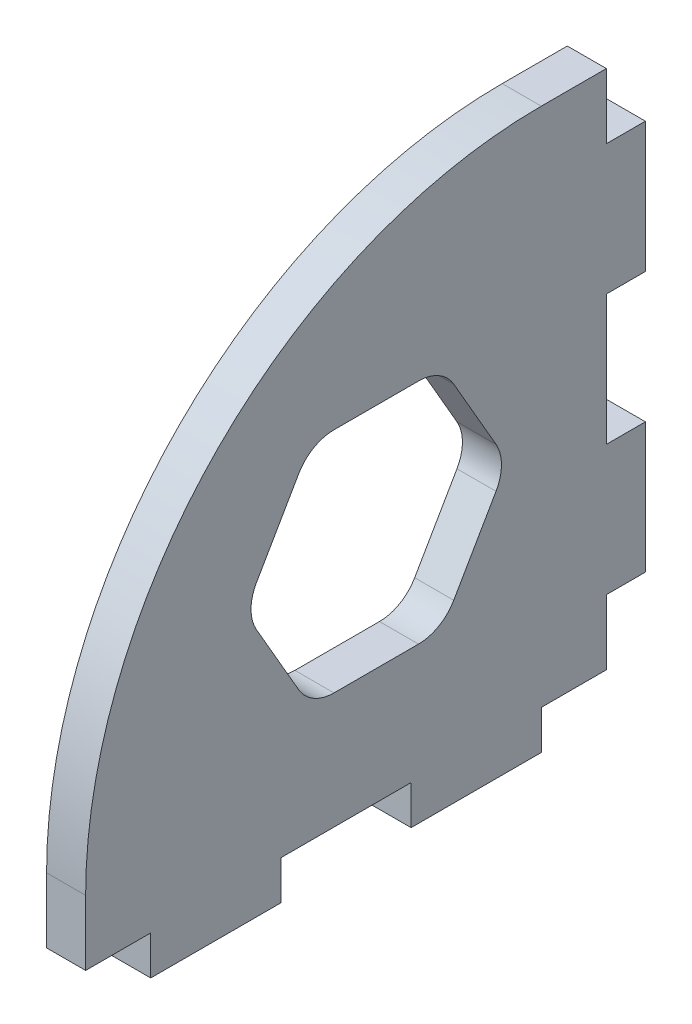
ISO-10303-21;
HEADER;
FILE_DESCRIPTION(('STEP AP214'),'2;1');
FILE_NAME('part.step','',(''),(''),'','','');
FILE_SCHEMA(('AUTOMOTIVE_DESIGN { 1 0 10303 214 1 1 1 1 }'));
ENDSEC;
DATA;
#1=APPLICATION_CONTEXT('core data for automotive mechanical design processes');
#2=APPLICATION_PROTOCOL_DEFINITION('international standard','automotive_design',2000,#1);
#3=PRODUCT_CONTEXT('',#1,'mechanical');
#4=PRODUCT('Part','Part','',(#3));
#5=PRODUCT_RELATED_PRODUCT_CATEGORY('part','',(#4));
#6=PRODUCT_DEFINITION_FORMATION('','',#4);
#7=PRODUCT_DEFINITION_CONTEXT('part definition',#1,'design');
#8=PRODUCT_DEFINITION('design','',#6,#7);
#9=PRODUCT_DEFINITION_SHAPE('','',#8);
#10=(LENGTH_UNIT() NAMED_UNIT(*) SI_UNIT(.MILLI.,.METRE.));
#11=(NAMED_UNIT(*) PLANE_ANGLE_UNIT() SI_UNIT($,.RADIAN.));
#12=(NAMED_UNIT(*) SI_UNIT($,.STERADIAN.) SOLID_ANGLE_UNIT());
#13=UNCERTAINTY_MEASURE_WITH_UNIT(LENGTH_MEASURE(1.E-05),#10,'distance_accuracy_value','');
#14=(GEOMETRIC_REPRESENTATION_CONTEXT(3) GLOBAL_UNCERTAINTY_ASSIGNED_CONTEXT((#13)) GLOBAL_UNIT_ASSIGNED_CONTEXT((#10,
#11,#12)) REPRESENTATION_CONTEXT('',''));
#15=CARTESIAN_POINT('',(0.,0.,0.));
#16=DIRECTION('',(0.,0.,1.));
#17=DIRECTION('',(1.,0.,0.));
#18=AXIS2_PLACEMENT_3D('',#15,#16,#17);
#19=CARTESIAN_POINT('',(1.5,4.99999999999995,5.));
#20=DIRECTION('',(-1.,0.,0.));
#21=DIRECTION('',(0.,0.,1.));
#22=AXIS2_PLACEMENT_3D('',#19,#20,#21);
#23=PLANE('',#22);
#24=DIRECTION('',(0.,1.,0.));
#25=VECTOR('',#24,1.);
#26=CARTESIAN_POINT('',(1.5,0.,0.));
#27=LINE('',#26,#25);
#28=CARTESIAN_POINT('',(1.5,0.,0.));
#29=VERTEX_POINT('',#28);
#30=CARTESIAN_POINT('',(1.5,5.,0.));
#31=VERTEX_POINT('',#30);
#32=EDGE_CURVE('E349',#29,#31,#27,.T.);
#33=ORIENTED_EDGE('',*,*,#32,.T.);
#34=DIRECTION('',(0.,0.,-1.));
#35=VECTOR('',#34,1.);
#36=CARTESIAN_POINT('',(1.5,5.,0.));
#37=LINE('',#36,#35);
#38=CARTESIAN_POINT('',(1.5,5.00000000000004,-2.99999999999994));
#39=VERTEX_POINT('',#38);
#40=EDGE_CURVE('E352',#31,#39,#37,.T.);
#41=ORIENTED_EDGE('',*,*,#40,.T.);
#42=DIRECTION('',(0.,1.,0.));
#43=VECTOR('',#42,1.);
#44=CARTESIAN_POINT('',(1.5,5.00000000000004,-2.99999999999994));
#45=LINE('',#44,#43);
#46=CARTESIAN_POINT('',(1.5,15.,-2.99999999999983));
#47=VERTEX_POINT('',#46);
#48=EDGE_CURVE('E355',#39,#47,#45,.T.);
#49=ORIENTED_EDGE('',*,*,#48,.T.);
#50=DIRECTION('',(0.,0.,1.));
#51=VECTOR('',#50,1.);
#52=CARTESIAN_POINT('',(1.5,15.,-2.99999999999983));
#53=LINE('',#52,#51);
#54=CARTESIAN_POINT('',(1.5,15.,1.73472347597681E-13));
#55=VERTEX_POINT('',#54);
#56=EDGE_CURVE('E357',#47,#55,#53,.T.);
#57=ORIENTED_EDGE('',*,*,#56,.T.);
#58=DIRECTION('',(0.,1.,0.));
#59=VECTOR('',#58,1.);
#60=CARTESIAN_POINT('',(1.5,15.,1.73472347597681E-13));
#61=LINE('',#60,#59);
#62=CARTESIAN_POINT('',(1.5,25.,2.91433543964104E-13));
#63=VERTEX_POINT('',#62);
#64=EDGE_CURVE('E359',#55,#63,#61,.T.);
#65=ORIENTED_EDGE('',*,*,#64,.T.);
#66=DIRECTION('',(0.,0.,-1.));
#67=VECTOR('',#66,1.);
#68=CARTESIAN_POINT('',(1.5,25.,2.91433543964104E-13));
#69=LINE('',#68,#67);
#70=CARTESIAN_POINT('',(1.5,25.,-2.99999999999971));
#71=VERTEX_POINT('',#70);
#72=EDGE_CURVE('E361',#63,#71,#69,.T.);
#73=ORIENTED_EDGE('',*,*,#72,.T.);
#74=DIRECTION('',(0.,1.,0.));
#75=VECTOR('',#74,1.);
#76=CARTESIAN_POINT('',(1.5,25.,-2.99999999999971));
#77=LINE('',#76,#75);
#78=CARTESIAN_POINT('',(1.5,35.,-2.99999999999959));
#79=VERTEX_POINT('',#78);
#80=EDGE_CURVE('E363',#71,#79,#77,.T.);
#81=ORIENTED_EDGE('',*,*,#80,.T.);
#82=DIRECTION('',(0.,0.,1.));
#83=VECTOR('',#82,1.);
#84=CARTESIAN_POINT('',(1.5,35.,-2.99999999999959));
#85=LINE('',#84,#83);
#86=CARTESIAN_POINT('',(1.5,35.,4.09394740330526E-13));
#87=VERTEX_POINT('',#86);
#88=EDGE_CURVE('E365',#79,#87,#85,.T.);
#89=ORIENTED_EDGE('',*,*,#88,.T.);
#90=DIRECTION('',(0.,1.,0.));
#91=VECTOR('',#90,1.);
#92=CARTESIAN_POINT('',(1.5,35.,4.09394740330526E-13));
#93=LINE('',#92,#91);
#94=CARTESIAN_POINT('',(1.5,40.,4.64905891561784E-13));
#95=VERTEX_POINT('',#94);
#96=EDGE_CURVE('E367',#87,#95,#93,.T.);
#97=ORIENTED_EDGE('',*,*,#96,.T.);
#98=DIRECTION('',(0.,0.,1.));
#99=VECTOR('',#98,1.);
#100=CARTESIAN_POINT('',(1.5,40.,4.64905891561784E-13));
#101=LINE('',#100,#99);
#102=CARTESIAN_POINT('',(1.5,40.,5.0000000000004));
#103=VERTEX_POINT('',#102);
#104=EDGE_CURVE('E369',#95,#103,#101,.T.);
#105=ORIENTED_EDGE('',*,*,#104,.T.);
#106=CARTESIAN_POINT('',(1.5,4.99999999999995,5.));
#107=DIRECTION('',(1.,0.,0.));
#108=DIRECTION('',(0.,0.,1.));
#109=AXIS2_PLACEMENT_3D('',#106,#107,#108);
#110=CIRCLE('',#109,35.);
#111=CARTESIAN_POINT('',(1.5,4.99999999999996,40.));
#112=VERTEX_POINT('',#111);
#113=EDGE_CURVE('E371',#103,#112,#110,.T.);
#114=ORIENTED_EDGE('',*,*,#113,.T.);
#115=DIRECTION('',(0.,-1.,0.));
#116=VECTOR('',#115,1.);
#117=CARTESIAN_POINT('',(1.5,0.,40.));
#118=LINE('',#117,#116);
#119=CARTESIAN_POINT('',(1.5,0.,40.));
#120=VERTEX_POINT('',#119);
#121=EDGE_CURVE('E373',#112,#120,#118,.T.);
#122=ORIENTED_EDGE('',*,*,#121,.T.);
#123=DIRECTION('',(0.,0.,-1.));
#124=VECTOR('',#123,1.);
#125=CARTESIAN_POINT('',(1.5,0.,35.));
#126=LINE('',#125,#124);
#127=CARTESIAN_POINT('',(1.5,0.,35.));
#128=VERTEX_POINT('',#127);
#129=EDGE_CURVE('E375',#120,#128,#126,.T.);
#130=ORIENTED_EDGE('',*,*,#129,.T.);
#131=DIRECTION('',(0.,-1.,0.));
#132=VECTOR('',#131,1.);
#133=CARTESIAN_POINT('',(1.5,-3.00000000000001,35.));
#134=LINE('',#133,#132);
#135=CARTESIAN_POINT('',(1.5,-3.00000000000001,35.));
#136=VERTEX_POINT('',#135);
#137=EDGE_CURVE('E377',#128,#136,#134,.T.);
#138=ORIENTED_EDGE('',*,*,#137,.T.);
#139=DIRECTION('',(0.,0.,-1.));
#140=VECTOR('',#139,1.);
#141=CARTESIAN_POINT('',(1.5,-3.,25.));
#142=LINE('',#141,#140);
#143=CARTESIAN_POINT('',(1.5,-3.,25.));
#144=VERTEX_POINT('',#143);
#145=EDGE_CURVE('E379',#136,#144,#142,.T.);
#146=ORIENTED_EDGE('',*,*,#145,.T.);
#147=DIRECTION('',(0.,1.,0.));
#148=VECTOR('',#147,1.);
#149=CARTESIAN_POINT('',(1.5,0.,25.));
#150=LINE('',#149,#148);
#151=CARTESIAN_POINT('',(1.5,0.,25.));
#152=VERTEX_POINT('',#151);
#153=EDGE_CURVE('E381',#144,#152,#150,.T.);
#154=ORIENTED_EDGE('',*,*,#153,.T.);
#155=DIRECTION('',(0.,0.,-1.));
#156=VECTOR('',#155,1.);
#157=CARTESIAN_POINT('',(1.5,0.,15.));
#158=LINE('',#157,#156);
#159=CARTESIAN_POINT('',(1.5,0.,15.));
#160=VERTEX_POINT('',#159);
#161=EDGE_CURVE('E383',#152,#160,#158,.T.);
#162=ORIENTED_EDGE('',*,*,#161,.T.);
#163=DIRECTION('',(0.,-1.,0.));
#164=VECTOR('',#163,1.);
#165=CARTESIAN_POINT('',(1.5,-3.,15.));
#166=LINE('',#165,#164);
#167=CARTESIAN_POINT('',(1.5,-3.,15.));
#168=VERTEX_POINT('',#167);
#169=EDGE_CURVE('E385',#160,#168,#166,.T.);
#170=ORIENTED_EDGE('',*,*,#169,.T.);
#171=DIRECTION('',(0.,0.,-1.));
#172=VECTOR('',#171,1.);
#173=CARTESIAN_POINT('',(1.5,-3.,5.));
#174=LINE('',#173,#172);
#175=CARTESIAN_POINT('',(1.5,-3.,5.));
#176=VERTEX_POINT('',#175);
#177=EDGE_CURVE('E387',#168,#176,#174,.T.);
#178=ORIENTED_EDGE('',*,*,#177,.T.);
#179=DIRECTION('',(0.,1.,0.));
#180=VECTOR('',#179,1.);
#181=CARTESIAN_POINT('',(1.5,0.,5.));
#182=LINE('',#181,#180);
#183=CARTESIAN_POINT('',(1.5,0.,5.));
#184=VERTEX_POINT('',#183);
#185=EDGE_CURVE('E389',#176,#184,#182,.T.);
#186=ORIENTED_EDGE('',*,*,#185,.T.);
#187=DIRECTION('',(0.,0.,-1.));
#188=VECTOR('',#187,1.);
#189=CARTESIAN_POINT('',(1.5,0.,0.));
#190=LINE('',#189,#188);
#191=EDGE_CURVE('E391',#184,#29,#190,.T.);
#192=ORIENTED_EDGE('',*,*,#191,.T.);
#193=EDGE_LOOP('',(#33,#41,#49,#57,#65,#73,#81,#89,#97,#105,#114,#122,#130,#138,#146,#154,#162,
#170,#178,#186,#192));
#194=FACE_BOUND('',#193,.T.);
#195=CARTESIAN_POINT('',(1.5,12.0526695296636,14.4300742654721));
#196=DIRECTION('',(1.,0.,0.));
#197=DIRECTION('',(0.,0.,-1.));
#198=AXIS2_PLACEMENT_3D('',#195,#196,#197);
#199=CIRCLE('',#198,3.125);
#200=CARTESIAN_POINT('',(1.5,8.92766952966359,14.4300742654721));
#201=VERTEX_POINT('',#200);
#202=CARTESIAN_POINT('',(1.5,10.4901695296636,11.7237448786458));
#203=VERTEX_POINT('',#202);
#204=EDGE_CURVE('E256',#201,#203,#199,.T.);
#205=ORIENTED_EDGE('',*,*,#204,.F.);
#206=DIRECTION('',(0.,0.,-1.));
#207=VECTOR('',#206,1.);
#208=CARTESIAN_POINT('',(1.5,8.92766952966359,20.9252647938554));
#209=LINE('',#208,#207);
#210=CARTESIAN_POINT('',(1.5,8.92766952966359,20.9252647938554));
#211=VERTEX_POINT('',#210);
#212=EDGE_CURVE('E297',#211,#201,#209,.T.);
#213=ORIENTED_EDGE('',*,*,#212,.F.);
#214=CARTESIAN_POINT('',(1.5,12.0526695296636,20.9252647938554));
#215=DIRECTION('',(1.,0.,0.));
#216=DIRECTION('',(0.,0.,-1.));
#217=AXIS2_PLACEMENT_3D('',#214,#215,#216);
#218=CIRCLE('',#217,3.125);
#219=CARTESIAN_POINT('',(1.5,10.4901695296636,23.6315941806818));
#220=VERTEX_POINT('',#219);
#221=EDGE_CURVE('E295',#220,#211,#218,.T.);
#222=ORIENTED_EDGE('',*,*,#221,.F.);
#223=DIRECTION('',(0.,-0.866025403784438,-0.5));
#224=VECTOR('',#223,1.);
#225=CARTESIAN_POINT('',(1.5,16.1151695296636,26.8791894448734));
#226=LINE('',#225,#224);
#227=CARTESIAN_POINT('',(1.5,16.1151695296636,26.8791894448734));
#228=VERTEX_POINT('',#227);
#229=EDGE_CURVE('E293',#228,#220,#226,.T.);
#230=ORIENTED_EDGE('',*,*,#229,.F.);
#231=CARTESIAN_POINT('',(1.5,17.6776695296636,24.1728600580471));
#232=DIRECTION('',(1.,0.,0.));
#233=DIRECTION('',(0.,0.,-1.));
#234=AXIS2_PLACEMENT_3D('',#231,#232,#233);
#235=CIRCLE('',#234,3.125);
#236=CARTESIAN_POINT('',(1.5,19.2401695296636,26.8791894448734));
#237=VERTEX_POINT('',#236);
#238=EDGE_CURVE('E291',#237,#228,#235,.T.);
#239=ORIENTED_EDGE('',*,*,#238,.F.);
#240=DIRECTION('',(0.,-0.866025403784438,0.500000000000001));
#241=VECTOR('',#240,1.);
#242=CARTESIAN_POINT('',(1.5,24.8651695296636,23.6315941806818));
#243=LINE('',#242,#241);
#244=CARTESIAN_POINT('',(1.5,24.8651695296636,23.6315941806818));
#245=VERTEX_POINT('',#244);
#246=EDGE_CURVE('E289',#245,#237,#243,.T.);
#247=ORIENTED_EDGE('',*,*,#246,.F.);
#248=CARTESIAN_POINT('',(1.5,23.3026695296636,20.9252647938554));
#249=DIRECTION('',(1.,0.,0.));
#250=DIRECTION('',(0.,0.,-1.));
#251=AXIS2_PLACEMENT_3D('',#248,#249,#250);
#252=CIRCLE('',#251,3.125);
#253=CARTESIAN_POINT('',(1.5,26.4276695296636,20.9252647938554));
#254=VERTEX_POINT('',#253);
#255=EDGE_CURVE('E287',#254,#245,#252,.T.);
#256=ORIENTED_EDGE('',*,*,#255,.F.);
#257=DIRECTION('',(0.,0.,1.));
#258=VECTOR('',#257,1.);
#259=CARTESIAN_POINT('',(1.5,26.4276695296636,14.4300742654721));
#260=LINE('',#259,#258);
#261=CARTESIAN_POINT('',(1.5,26.4276695296636,14.4300742654721));
#262=VERTEX_POINT('',#261);
#263=EDGE_CURVE('E285',#262,#254,#260,.T.);
#264=ORIENTED_EDGE('',*,*,#263,.F.);
#265=CARTESIAN_POINT('',(1.5,23.3026695296636,14.4300742654721));
#266=DIRECTION('',(1.,0.,0.));
#267=DIRECTION('',(0.,0.,-1.));
#268=AXIS2_PLACEMENT_3D('',#265,#266,#267);
#269=CIRCLE('',#268,3.125);
#270=CARTESIAN_POINT('',(1.5,24.8651695296636,11.7237448786458));
#271=VERTEX_POINT('',#270);
#272=EDGE_CURVE('E283',#271,#262,#269,.T.);
#273=ORIENTED_EDGE('',*,*,#272,.F.);
#274=DIRECTION('',(0.,0.866025403784439,0.5));
#275=VECTOR('',#274,1.);
#276=CARTESIAN_POINT('',(1.5,19.2401695296636,8.47614961445412));
#277=LINE('',#276,#275);
#278=CARTESIAN_POINT('',(1.5,19.2401695296636,8.47614961445412));
#279=VERTEX_POINT('',#278);
#280=EDGE_CURVE('E279',#279,#271,#277,.T.);
#281=ORIENTED_EDGE('',*,*,#280,.F.);
#282=CARTESIAN_POINT('',(1.5,17.6776695296636,11.1824790012805));
#283=DIRECTION('',(1.,0.,0.));
#284=DIRECTION('',(0.,0.,1.));
#285=AXIS2_PLACEMENT_3D('',#282,#283,#284);
#286=CIRCLE('',#285,3.125);
#287=CARTESIAN_POINT('',(1.5,16.1151695296636,8.47614961445412));
#288=VERTEX_POINT('',#287);
#289=EDGE_CURVE('E277',#288,#279,#286,.T.);
#290=ORIENTED_EDGE('',*,*,#289,.F.);
#291=DIRECTION('',(0.,0.866025403784438,-0.500000000000001));
#292=VECTOR('',#291,1.);
#293=CARTESIAN_POINT('',(1.5,10.4901695296636,11.7237448786458));
#294=LINE('',#293,#292);
#295=EDGE_CURVE('E264',#203,#288,#294,.T.);
#296=ORIENTED_EDGE('',*,*,#295,.F.);
#297=EDGE_LOOP('',(#205,#213,#222,#230,#239,#247,#256,#264,#273,#281,#290,#296));
#298=FACE_BOUND('',#297,.T.);
#299=ADVANCED_FACE('F41',(#194,#298),#23,.F.);
#300=CARTESIAN_POINT('',(-1.5,4.99999999999995,5.));
#301=DIRECTION('',(-1.,0.,0.));
#302=DIRECTION('',(0.,0.,1.));
#303=AXIS2_PLACEMENT_3D('',#300,#301,#302);
#304=PLANE('',#303);
#305=DIRECTION('',(0.,1.,0.));
#306=VECTOR('',#305,1.);
#307=CARTESIAN_POINT('',(-1.5,0.,0.));
#308=LINE('',#307,#306);
#309=CARTESIAN_POINT('',(-1.5,0.,0.));
#310=VERTEX_POINT('',#309);
#311=CARTESIAN_POINT('',(-1.5,5.,0.));
#312=VERTEX_POINT('',#311);
#313=EDGE_CURVE('E272',#310,#312,#308,.T.);
#314=ORIENTED_EDGE('',*,*,#313,.F.);
#315=DIRECTION('',(0.,0.,-1.));
#316=VECTOR('',#315,1.);
#317=CARTESIAN_POINT('',(-1.5,0.,0.));
#318=LINE('',#317,#316);
#319=CARTESIAN_POINT('',(-1.5,0.,5.));
#320=VERTEX_POINT('',#319);
#321=EDGE_CURVE('E353',#320,#310,#318,.T.);
#322=ORIENTED_EDGE('',*,*,#321,.F.);
#323=DIRECTION('',(0.,1.,0.));
#324=VECTOR('',#323,1.);
#325=CARTESIAN_POINT('',(-1.5,0.,5.));
#326=LINE('',#325,#324);
#327=CARTESIAN_POINT('',(-1.5,-3.,5.));
#328=VERTEX_POINT('',#327);
#329=EDGE_CURVE('E432',#328,#320,#326,.T.);
#330=ORIENTED_EDGE('',*,*,#329,.F.);
#331=DIRECTION('',(0.,0.,-1.));
#332=VECTOR('',#331,1.);
#333=CARTESIAN_POINT('',(-1.5,-3.,5.));
#334=LINE('',#333,#332);
#335=CARTESIAN_POINT('',(-1.5,-3.,15.));
#336=VERTEX_POINT('',#335);
#337=EDGE_CURVE('E430',#336,#328,#334,.T.);
#338=ORIENTED_EDGE('',*,*,#337,.F.);
#339=DIRECTION('',(0.,-1.,0.));
#340=VECTOR('',#339,1.);
#341=CARTESIAN_POINT('',(-1.5,-3.,15.));
#342=LINE('',#341,#340);
#343=CARTESIAN_POINT('',(-1.5,0.,15.));
#344=VERTEX_POINT('',#343);
#345=EDGE_CURVE('E428',#344,#336,#342,.T.);
#346=ORIENTED_EDGE('',*,*,#345,.F.);
#347=DIRECTION('',(0.,0.,-1.));
#348=VECTOR('',#347,1.);
#349=CARTESIAN_POINT('',(-1.5,0.,15.));
#350=LINE('',#349,#348);
#351=CARTESIAN_POINT('',(-1.5,0.,25.));
#352=VERTEX_POINT('',#351);
#353=EDGE_CURVE('E426',#352,#344,#350,.T.);
#354=ORIENTED_EDGE('',*,*,#353,.F.);
#355=DIRECTION('',(0.,1.,0.));
#356=VECTOR('',#355,1.);
#357=CARTESIAN_POINT('',(-1.5,0.,25.));
#358=LINE('',#357,#356);
#359=CARTESIAN_POINT('',(-1.5,-3.,25.));
#360=VERTEX_POINT('',#359);
#361=EDGE_CURVE('E424',#360,#352,#358,.T.);
#362=ORIENTED_EDGE('',*,*,#361,.F.);
#363=DIRECTION('',(0.,0.,-1.));
#364=VECTOR('',#363,1.);
#365=CARTESIAN_POINT('',(-1.5,-3.,25.));
#366=LINE('',#365,#364);
#367=CARTESIAN_POINT('',(-1.5,-3.00000000000001,35.));
#368=VERTEX_POINT('',#367);
#369=EDGE_CURVE('E422',#368,#360,#366,.T.);
#370=ORIENTED_EDGE('',*,*,#369,.F.);
#371=DIRECTION('',(0.,-1.,0.));
#372=VECTOR('',#371,1.);
#373=CARTESIAN_POINT('',(-1.5,-3.00000000000001,35.));
#374=LINE('',#373,#372);
#375=CARTESIAN_POINT('',(-1.5,0.,35.));
#376=VERTEX_POINT('',#375);
#377=EDGE_CURVE('E420',#376,#368,#374,.T.);
#378=ORIENTED_EDGE('',*,*,#377,.F.);
#379=DIRECTION('',(0.,0.,-1.));
#380=VECTOR('',#379,1.);
#381=CARTESIAN_POINT('',(-1.5,0.,35.));
#382=LINE('',#381,#380);
#383=CARTESIAN_POINT('',(-1.5,0.,40.));
#384=VERTEX_POINT('',#383);
#385=EDGE_CURVE('E418',#384,#376,#382,.T.);
#386=ORIENTED_EDGE('',*,*,#385,.F.);
#387=DIRECTION('',(0.,-1.,0.));
#388=VECTOR('',#387,1.);
#389=CARTESIAN_POINT('',(-1.5,0.,40.));
#390=LINE('',#389,#388);
#391=CARTESIAN_POINT('',(-1.5,4.99999999999996,40.));
#392=VERTEX_POINT('',#391);
#393=EDGE_CURVE('E416',#392,#384,#390,.T.);
#394=ORIENTED_EDGE('',*,*,#393,.F.);
#395=CARTESIAN_POINT('',(-1.5,4.99999999999995,5.));
#396=DIRECTION('',(1.,0.,0.));
#397=DIRECTION('',(0.,0.,1.));
#398=AXIS2_PLACEMENT_3D('',#395,#396,#397);
#399=CIRCLE('',#398,35.);
#400=CARTESIAN_POINT('',(-1.5,40.,5.0000000000004));
#401=VERTEX_POINT('',#400);
#402=EDGE_CURVE('E414',#401,#392,#399,.T.);
#403=ORIENTED_EDGE('',*,*,#402,.F.);
#404=DIRECTION('',(0.,0.,1.));
#405=VECTOR('',#404,1.);
#406=CARTESIAN_POINT('',(-1.5,40.,4.64905891561784E-13));
#407=LINE('',#406,#405);
#408=CARTESIAN_POINT('',(-1.5,40.,4.64905891561784E-13));
#409=VERTEX_POINT('',#408);
#410=EDGE_CURVE('E412',#409,#401,#407,.T.);
#411=ORIENTED_EDGE('',*,*,#410,.F.);
#412=DIRECTION('',(0.,1.,0.));
#413=VECTOR('',#412,1.);
#414=CARTESIAN_POINT('',(-1.5,35.,4.09394740330526E-13));
#415=LINE('',#414,#413);
#416=CARTESIAN_POINT('',(-1.5,35.,4.09394740330526E-13));
#417=VERTEX_POINT('',#416);
#418=EDGE_CURVE('E410',#417,#409,#415,.T.);
#419=ORIENTED_EDGE('',*,*,#418,.F.);
#420=DIRECTION('',(0.,0.,1.));
#421=VECTOR('',#420,1.);
#422=CARTESIAN_POINT('',(-1.5,35.,-2.99999999999959));
#423=LINE('',#422,#421);
#424=CARTESIAN_POINT('',(-1.5,35.,-2.99999999999959));
#425=VERTEX_POINT('',#424);
#426=EDGE_CURVE('E408',#425,#417,#423,.T.);
#427=ORIENTED_EDGE('',*,*,#426,.F.);
#428=DIRECTION('',(0.,1.,0.));
#429=VECTOR('',#428,1.);
#430=CARTESIAN_POINT('',(-1.5,25.,-2.99999999999971));
#431=LINE('',#430,#429);
#432=CARTESIAN_POINT('',(-1.5,25.,-2.99999999999971));
#433=VERTEX_POINT('',#432);
#434=EDGE_CURVE('E406',#433,#425,#431,.T.);
#435=ORIENTED_EDGE('',*,*,#434,.F.);
#436=DIRECTION('',(0.,0.,-1.));
#437=VECTOR('',#436,1.);
#438=CARTESIAN_POINT('',(-1.5,25.,2.91433543964104E-13));
#439=LINE('',#438,#437);
#440=CARTESIAN_POINT('',(-1.5,25.,2.91433543964104E-13));
#441=VERTEX_POINT('',#440);
#442=EDGE_CURVE('E404',#441,#433,#439,.T.);
#443=ORIENTED_EDGE('',*,*,#442,.F.);
#444=DIRECTION('',(0.,1.,0.));
#445=VECTOR('',#444,1.);
#446=CARTESIAN_POINT('',(-1.5,15.,1.73472347597681E-13));
#447=LINE('',#446,#445);
#448=CARTESIAN_POINT('',(-1.5,15.,1.73472347597681E-13));
#449=VERTEX_POINT('',#448);
#450=EDGE_CURVE('E402',#449,#441,#447,.T.);
#451=ORIENTED_EDGE('',*,*,#450,.F.);
#452=DIRECTION('',(0.,0.,1.));
#453=VECTOR('',#452,1.);
#454=CARTESIAN_POINT('',(-1.5,15.,-2.99999999999983));
#455=LINE('',#454,#453);
#456=CARTESIAN_POINT('',(-1.5,15.,-2.99999999999983));
#457=VERTEX_POINT('',#456);
#458=EDGE_CURVE('E400',#457,#449,#455,.T.);
#459=ORIENTED_EDGE('',*,*,#458,.F.);
#460=DIRECTION('',(0.,1.,0.));
#461=VECTOR('',#460,1.);
#462=CARTESIAN_POINT('',(-1.5,5.00000000000004,-2.99999999999994));
#463=LINE('',#462,#461);
#464=CARTESIAN_POINT('',(-1.5,5.00000000000004,-2.99999999999994));
#465=VERTEX_POINT('',#464);
#466=EDGE_CURVE('E398',#465,#457,#463,.T.);
#467=ORIENTED_EDGE('',*,*,#466,.F.);
#468=DIRECTION('',(0.,0.,-1.));
#469=VECTOR('',#468,1.);
#470=CARTESIAN_POINT('',(-1.5,5.,0.));
#471=LINE('',#470,#469);
#472=EDGE_CURVE('E396',#312,#465,#471,.T.);
#473=ORIENTED_EDGE('',*,*,#472,.F.);
#474=EDGE_LOOP('',(#314,#322,#330,#338,#346,#354,#362,#370,#378,#386,#394,#403,#411,#419,#427,
#435,#443,#451,#459,#467,#473));
#475=FACE_BOUND('',#474,.T.);
#476=DIRECTION('',(0.,0.,-1.));
#477=VECTOR('',#476,1.);
#478=CARTESIAN_POINT('',(-1.5,8.92766952966359,20.9252647938554));
#479=LINE('',#478,#477);
#480=CARTESIAN_POINT('',(-1.5,8.92766952966359,20.9252647938554));
#481=VERTEX_POINT('',#480);
#482=CARTESIAN_POINT('',(-1.5,8.92766952966359,14.4300742654721));
#483=VERTEX_POINT('',#482);
#484=EDGE_CURVE('E265',#481,#483,#479,.T.);
#485=ORIENTED_EDGE('',*,*,#484,.T.);
#486=CARTESIAN_POINT('',(-1.5,12.0526695296636,14.4300742654721));
#487=DIRECTION('',(1.,0.,0.));
#488=DIRECTION('',(0.,0.,-1.));
#489=AXIS2_PLACEMENT_3D('',#486,#487,#488);
#490=CIRCLE('',#489,3.125);
#491=CARTESIAN_POINT('',(-1.5,10.4901695296636,11.7237448786458));
#492=VERTEX_POINT('',#491);
#493=EDGE_CURVE('E64',#483,#492,#490,.T.);
#494=ORIENTED_EDGE('',*,*,#493,.T.);
#495=DIRECTION('',(0.,0.866025403784438,-0.500000000000001));
#496=VECTOR('',#495,1.);
#497=CARTESIAN_POINT('',(-1.5,10.4901695296636,11.7237448786458));
#498=LINE('',#497,#496);
#499=CARTESIAN_POINT('',(-1.5,16.1151695296636,8.47614961445412));
#500=VERTEX_POINT('',#499);
#501=EDGE_CURVE('E271',#492,#500,#498,.T.);
#502=ORIENTED_EDGE('',*,*,#501,.T.);
#503=CARTESIAN_POINT('',(-1.5,17.6776695296636,11.1824790012805));
#504=DIRECTION('',(1.,0.,0.));
#505=DIRECTION('',(0.,0.,1.));
#506=AXIS2_PLACEMENT_3D('',#503,#504,#505);
#507=CIRCLE('',#506,3.125);
#508=CARTESIAN_POINT('',(-1.5,19.2401695296636,8.47614961445412));
#509=VERTEX_POINT('',#508);
#510=EDGE_CURVE('E301',#500,#509,#507,.T.);
#511=ORIENTED_EDGE('',*,*,#510,.T.);
#512=DIRECTION('',(0.,0.866025403784439,0.5));
#513=VECTOR('',#512,1.);
#514=CARTESIAN_POINT('',(-1.5,19.2401695296636,8.47614961445412));
#515=LINE('',#514,#513);
#516=CARTESIAN_POINT('',(-1.5,24.8651695296636,11.7237448786458));
#517=VERTEX_POINT('',#516);
#518=EDGE_CURVE('E304',#509,#517,#515,.T.);
#519=ORIENTED_EDGE('',*,*,#518,.T.);
#520=CARTESIAN_POINT('',(-1.5,23.3026695296636,14.4300742654721));
#521=DIRECTION('',(1.,0.,0.));
#522=DIRECTION('',(0.,0.,-1.));
#523=AXIS2_PLACEMENT_3D('',#520,#521,#522);
#524=CIRCLE('',#523,3.125);
#525=CARTESIAN_POINT('',(-1.5,26.4276695296636,14.4300742654721));
#526=VERTEX_POINT('',#525);
#527=EDGE_CURVE('E307',#517,#526,#524,.T.);
#528=ORIENTED_EDGE('',*,*,#527,.T.);
#529=DIRECTION('',(0.,0.,1.));
#530=VECTOR('',#529,1.);
#531=CARTESIAN_POINT('',(-1.5,26.4276695296636,14.4300742654721));
#532=LINE('',#531,#530);
#533=CARTESIAN_POINT('',(-1.5,26.4276695296636,20.9252647938554));
#534=VERTEX_POINT('',#533);
#535=EDGE_CURVE('E310',#526,#534,#532,.T.);
#536=ORIENTED_EDGE('',*,*,#535,.T.);
#537=CARTESIAN_POINT('',(-1.5,23.3026695296636,20.9252647938554));
#538=DIRECTION('',(1.,0.,0.));
#539=DIRECTION('',(0.,0.,-1.));
#540=AXIS2_PLACEMENT_3D('',#537,#538,#539);
#541=CIRCLE('',#540,3.125);
#542=CARTESIAN_POINT('',(-1.5,24.8651695296636,23.6315941806818));
#543=VERTEX_POINT('',#542);
#544=EDGE_CURVE('E313',#534,#543,#541,.T.);
#545=ORIENTED_EDGE('',*,*,#544,.T.);
#546=DIRECTION('',(0.,-0.866025403784438,0.500000000000001));
#547=VECTOR('',#546,1.);
#548=CARTESIAN_POINT('',(-1.5,24.8651695296636,23.6315941806818));
#549=LINE('',#548,#547);
#550=CARTESIAN_POINT('',(-1.5,19.2401695296636,26.8791894448734));
#551=VERTEX_POINT('',#550);
#552=EDGE_CURVE('E316',#543,#551,#549,.T.);
#553=ORIENTED_EDGE('',*,*,#552,.T.);
#554=CARTESIAN_POINT('',(-1.5,17.6776695296636,24.1728600580471));
#555=DIRECTION('',(1.,0.,0.));
#556=DIRECTION('',(0.,0.,-1.));
#557=AXIS2_PLACEMENT_3D('',#554,#555,#556);
#558=CIRCLE('',#557,3.125);
#559=CARTESIAN_POINT('',(-1.5,16.1151695296636,26.8791894448734));
#560=VERTEX_POINT('',#559);
#561=EDGE_CURVE('E319',#551,#560,#558,.T.);
#562=ORIENTED_EDGE('',*,*,#561,.T.);
#563=DIRECTION('',(0.,-0.866025403784438,-0.5));
#564=VECTOR('',#563,1.);
#565=CARTESIAN_POINT('',(-1.5,16.1151695296636,26.8791894448734));
#566=LINE('',#565,#564);
#567=CARTESIAN_POINT('',(-1.5,10.4901695296636,23.6315941806818));
#568=VERTEX_POINT('',#567);
#569=EDGE_CURVE('E322',#560,#568,#566,.T.);
#570=ORIENTED_EDGE('',*,*,#569,.T.);
#571=CARTESIAN_POINT('',(-1.5,12.0526695296636,20.9252647938554));
#572=DIRECTION('',(1.,0.,0.));
#573=DIRECTION('',(0.,0.,-1.));
#574=AXIS2_PLACEMENT_3D('',#571,#572,#573);
#575=CIRCLE('',#574,3.125);
#576=EDGE_CURVE('E325',#568,#481,#575,.T.);
#577=ORIENTED_EDGE('',*,*,#576,.T.);
#578=EDGE_LOOP('',(#485,#494,#502,#511,#519,#528,#536,#545,#553,#562,#570,#577));
#579=FACE_BOUND('',#578,.T.);
#580=ADVANCED_FACE('F501',(#475,#579),#304,.T.);
#581=CARTESIAN_POINT('',(1.5,0.,0.));
#582=DIRECTION('',(0.,0.,1.));
#583=DIRECTION('',(0.,-1.,0.));
#584=AXIS2_PLACEMENT_3D('',#581,#582,#583);
#585=PLANE('',#584);
#586=ORIENTED_EDGE('',*,*,#313,.T.);
#587=DIRECTION('',(-1.,0.,0.));
#588=VECTOR('',#587,1.);
#589=CARTESIAN_POINT('',(1.5,5.,0.));
#590=LINE('',#589,#588);
#591=EDGE_CURVE('E11',#31,#312,#590,.T.);
#592=ORIENTED_EDGE('',*,*,#591,.F.);
#593=ORIENTED_EDGE('',*,*,#32,.F.);
#594=DIRECTION('',(-1.,0.,0.));
#595=VECTOR('',#594,1.);
#596=CARTESIAN_POINT('',(1.5,0.,0.));
#597=LINE('',#596,#595);
#598=EDGE_CURVE('E393',#29,#310,#597,.T.);
#599=ORIENTED_EDGE('',*,*,#598,.T.);
#600=EDGE_LOOP('',(#586,#592,#593,#599));
#601=FACE_BOUND('',#600,.T.);
#602=ADVANCED_FACE('F43',(#601),#585,.F.);
#603=CARTESIAN_POINT('',(1.5,5.,0.));
#604=DIRECTION('',(0.,1.,0.));
#605=DIRECTION('',(0.,0.,1.));
#606=AXIS2_PLACEMENT_3D('',#603,#604,#605);
#607=PLANE('',#606);
#608=ORIENTED_EDGE('',*,*,#472,.T.);
#609=DIRECTION('',(-1.,0.,0.));
#610=VECTOR('',#609,1.);
#611=CARTESIAN_POINT('',(1.5,5.00000000000004,-2.99999999999994));
#612=LINE('',#611,#610);
#613=EDGE_CURVE('E49',#39,#465,#612,.T.);
#614=ORIENTED_EDGE('',*,*,#613,.F.);
#615=ORIENTED_EDGE('',*,*,#40,.F.);
#616=ORIENTED_EDGE('',*,*,#591,.T.);
#617=EDGE_LOOP('',(#608,#614,#615,#616));
#618=FACE_BOUND('',#617,.T.);
#619=ADVANCED_FACE('F518',(#618),#607,.F.);
#620=CARTESIAN_POINT('',(1.5,5.00000000000004,-2.99999999999994));
#621=DIRECTION('',(0.,0.,1.));
#622=DIRECTION('',(0.,-1.,0.));
#623=AXIS2_PLACEMENT_3D('',#620,#621,#622);
#624=PLANE('',#623);
#625=ORIENTED_EDGE('',*,*,#466,.T.);
#626=DIRECTION('',(-1.,0.,0.));
#627=VECTOR('',#626,1.);
#628=CARTESIAN_POINT('',(1.5,15.,-2.99999999999983));
#629=LINE('',#628,#627);
#630=EDGE_CURVE('E488',#47,#457,#629,.T.);
#631=ORIENTED_EDGE('',*,*,#630,.F.);
#632=ORIENTED_EDGE('',*,*,#48,.F.);
#633=ORIENTED_EDGE('',*,*,#613,.T.);
#634=EDGE_LOOP('',(#625,#631,#632,#633));
#635=FACE_BOUND('',#634,.T.);
#636=ADVANCED_FACE('F495',(#635),#624,.F.);
#637=CARTESIAN_POINT('',(1.5,15.,-2.99999999999983));
#638=DIRECTION('',(0.,-1.,0.));
#639=DIRECTION('',(0.,0.,-1.));
#640=AXIS2_PLACEMENT_3D('',#637,#638,#639);
#641=PLANE('',#640);
#642=ORIENTED_EDGE('',*,*,#458,.T.);
#643=DIRECTION('',(-1.,0.,0.));
#644=VECTOR('',#643,1.);
#645=CARTESIAN_POINT('',(1.5,15.,1.73472347597681E-13));
#646=LINE('',#645,#644);
#647=EDGE_CURVE('E485',#55,#449,#646,.T.);
#648=ORIENTED_EDGE('',*,*,#647,.F.);
#649=ORIENTED_EDGE('',*,*,#56,.F.);
#650=ORIENTED_EDGE('',*,*,#630,.T.);
#651=EDGE_LOOP('',(#642,#648,#649,#650));
#652=FACE_BOUND('',#651,.T.);
#653=ADVANCED_FACE('F507',(#652),#641,.F.);
#654=CARTESIAN_POINT('',(1.5,15.,1.73472347597681E-13));
#655=DIRECTION('',(0.,0.,1.));
#656=DIRECTION('',(0.,-1.,0.));
#657=AXIS2_PLACEMENT_3D('',#654,#655,#656);
#658=PLANE('',#657);
#659=ORIENTED_EDGE('',*,*,#450,.T.);
#660=DIRECTION('',(-1.,0.,0.));
#661=VECTOR('',#660,1.);
#662=CARTESIAN_POINT('',(1.5,25.,2.91433543964104E-13));
#663=LINE('',#662,#661);
#664=EDGE_CURVE('E482',#63,#441,#663,.T.);
#665=ORIENTED_EDGE('',*,*,#664,.F.);
#666=ORIENTED_EDGE('',*,*,#64,.F.);
#667=ORIENTED_EDGE('',*,*,#647,.T.);
#668=EDGE_LOOP('',(#659,#665,#666,#667));
#669=FACE_BOUND('',#668,.T.);
#670=ADVANCED_FACE('F511',(#669),#658,.F.);
#671=CARTESIAN_POINT('',(1.5,25.,2.91433543964104E-13));
#672=DIRECTION('',(0.,1.,0.));
#673=DIRECTION('',(0.,0.,1.));
#674=AXIS2_PLACEMENT_3D('',#671,#672,#673);
#675=PLANE('',#674);
#676=ORIENTED_EDGE('',*,*,#442,.T.);
#677=DIRECTION('',(-1.,0.,0.));
#678=VECTOR('',#677,1.);
#679=CARTESIAN_POINT('',(1.5,25.,-2.99999999999971));
#680=LINE('',#679,#678);
#681=EDGE_CURVE('E479',#71,#433,#680,.T.);
#682=ORIENTED_EDGE('',*,*,#681,.F.);
#683=ORIENTED_EDGE('',*,*,#72,.F.);
#684=ORIENTED_EDGE('',*,*,#664,.T.);
#685=EDGE_LOOP('',(#676,#682,#683,#684));
#686=FACE_BOUND('',#685,.T.);
#687=ADVANCED_FACE('F596',(#686),#675,.F.);
#688=CARTESIAN_POINT('',(1.5,25.,-2.99999999999971));
#689=DIRECTION('',(0.,0.,1.));
#690=DIRECTION('',(0.,-1.,0.));
#691=AXIS2_PLACEMENT_3D('',#688,#689,#690);
#692=PLANE('',#691);
#693=ORIENTED_EDGE('',*,*,#434,.T.);
#694=DIRECTION('',(-1.,0.,0.));
#695=VECTOR('',#694,1.);
#696=CARTESIAN_POINT('',(1.5,35.,-2.99999999999959));
#697=LINE('',#696,#695);
#698=EDGE_CURVE('E476',#79,#425,#697,.T.);
#699=ORIENTED_EDGE('',*,*,#698,.F.);
#700=ORIENTED_EDGE('',*,*,#80,.F.);
#701=ORIENTED_EDGE('',*,*,#681,.T.);
#702=EDGE_LOOP('',(#693,#699,#700,#701));
#703=FACE_BOUND('',#702,.T.);
#704=ADVANCED_FACE('F594',(#703),#692,.F.);
#705=CARTESIAN_POINT('',(1.5,35.,-2.99999999999959));
#706=DIRECTION('',(0.,-1.,0.));
#707=DIRECTION('',(0.,0.,-1.));
#708=AXIS2_PLACEMENT_3D('',#705,#706,#707);
#709=PLANE('',#708);
#710=ORIENTED_EDGE('',*,*,#426,.T.);
#711=DIRECTION('',(-1.,0.,0.));
#712=VECTOR('',#711,1.);
#713=CARTESIAN_POINT('',(1.5,35.,4.09394740330526E-13));
#714=LINE('',#713,#712);
#715=EDGE_CURVE('E473',#87,#417,#714,.T.);
#716=ORIENTED_EDGE('',*,*,#715,.F.);
#717=ORIENTED_EDGE('',*,*,#88,.F.);
#718=ORIENTED_EDGE('',*,*,#698,.T.);
#719=EDGE_LOOP('',(#710,#716,#717,#718));
#720=FACE_BOUND('',#719,.T.);
#721=ADVANCED_FACE('F590',(#720),#709,.F.);
#722=CARTESIAN_POINT('',(1.5,35.,4.09394740330526E-13));
#723=DIRECTION('',(0.,0.,1.));
#724=DIRECTION('',(0.,-1.,0.));
#725=AXIS2_PLACEMENT_3D('',#722,#723,#724);
#726=PLANE('',#725);
#727=ORIENTED_EDGE('',*,*,#418,.T.);
#728=DIRECTION('',(-1.,0.,0.));
#729=VECTOR('',#728,1.);
#730=CARTESIAN_POINT('',(1.5,40.,4.64905891561784E-13));
#731=LINE('',#730,#729);
#732=EDGE_CURVE('E470',#95,#409,#731,.T.);
#733=ORIENTED_EDGE('',*,*,#732,.F.);
#734=ORIENTED_EDGE('',*,*,#96,.F.);
#735=ORIENTED_EDGE('',*,*,#715,.T.);
#736=EDGE_LOOP('',(#727,#733,#734,#735));
#737=FACE_BOUND('',#736,.T.);
#738=ADVANCED_FACE('F585',(#737),#726,.F.);
#739=CARTESIAN_POINT('',(1.5,40.,4.64905891561784E-13));
#740=DIRECTION('',(0.,-1.,0.));
#741=DIRECTION('',(0.,0.,-1.));
#742=AXIS2_PLACEMENT_3D('',#739,#740,#741);
#743=PLANE('',#742);
#744=ORIENTED_EDGE('',*,*,#410,.T.);
#745=DIRECTION('',(-1.,0.,0.));
#746=VECTOR('',#745,1.);
#747=CARTESIAN_POINT('',(1.5,40.,5.0000000000004));
#748=LINE('',#747,#746);
#749=EDGE_CURVE('E467',#103,#401,#748,.T.);
#750=ORIENTED_EDGE('',*,*,#749,.F.);
#751=ORIENTED_EDGE('',*,*,#104,.F.);
#752=ORIENTED_EDGE('',*,*,#732,.T.);
#753=EDGE_LOOP('',(#744,#750,#751,#752));
#754=FACE_BOUND('',#753,.T.);
#755=ADVANCED_FACE('F579',(#754),#743,.F.);
#756=CARTESIAN_POINT('',(1.5,4.99999999999995,5.));
#757=DIRECTION('',(-1.,0.,0.));
#758=DIRECTION('',(0.,0.,1.));
#759=AXIS2_PLACEMENT_3D('',#756,#757,#758);
#760=CYLINDRICAL_SURFACE('',#759,35.);
#761=ORIENTED_EDGE('',*,*,#402,.T.);
#762=DIRECTION('',(-1.,0.,0.));
#763=VECTOR('',#762,1.);
#764=CARTESIAN_POINT('',(1.5,4.99999999999996,40.));
#765=LINE('',#764,#763);
#766=EDGE_CURVE('E464',#112,#392,#765,.T.);
#767=ORIENTED_EDGE('',*,*,#766,.F.);
#768=ORIENTED_EDGE('',*,*,#113,.F.);
#769=ORIENTED_EDGE('',*,*,#749,.T.);
#770=EDGE_LOOP('',(#761,#767,#768,#769));
#771=FACE_BOUND('',#770,.T.);
#772=ADVANCED_FACE('F575',(#771),#760,.T.);
#773=CARTESIAN_POINT('',(1.5,0.,40.));
#774=DIRECTION('',(0.,0.,-1.));
#775=DIRECTION('',(-1.,0.,0.));
#776=AXIS2_PLACEMENT_3D('',#773,#774,#775);
#777=PLANE('',#776);
#778=ORIENTED_EDGE('',*,*,#393,.T.);
#779=DIRECTION('',(-1.,0.,0.));
#780=VECTOR('',#779,1.);
#781=CARTESIAN_POINT('',(1.5,0.,40.));
#782=LINE('',#781,#780);
#783=EDGE_CURVE('E461',#120,#384,#782,.T.);
#784=ORIENTED_EDGE('',*,*,#783,.F.);
#785=ORIENTED_EDGE('',*,*,#121,.F.);
#786=ORIENTED_EDGE('',*,*,#766,.T.);
#787=EDGE_LOOP('',(#778,#784,#785,#786));
#788=FACE_BOUND('',#787,.T.);
#789=ADVANCED_FACE('F570',(#788),#777,.F.);
#790=CARTESIAN_POINT('',(1.5,0.,35.));
#791=DIRECTION('',(0.,1.,0.));
#792=DIRECTION('',(0.,0.,1.));
#793=AXIS2_PLACEMENT_3D('',#790,#791,#792);
#794=PLANE('',#793);
#795=ORIENTED_EDGE('',*,*,#385,.T.);
#796=DIRECTION('',(-1.,0.,0.));
#797=VECTOR('',#796,1.);
#798=CARTESIAN_POINT('',(1.5,0.,35.));
#799=LINE('',#798,#797);
#800=EDGE_CURVE('E458',#128,#376,#799,.T.);
#801=ORIENTED_EDGE('',*,*,#800,.F.);
#802=ORIENTED_EDGE('',*,*,#129,.F.);
#803=ORIENTED_EDGE('',*,*,#783,.T.);
#804=EDGE_LOOP('',(#795,#801,#802,#803));
#805=FACE_BOUND('',#804,.T.);
#806=ADVANCED_FACE('F564',(#805),#794,.F.);
#807=CARTESIAN_POINT('',(1.5,-3.00000000000001,35.));
#808=DIRECTION('',(0.,0.,-1.));
#809=DIRECTION('',(-1.,0.,0.));
#810=AXIS2_PLACEMENT_3D('',#807,#808,#809);
#811=PLANE('',#810);
#812=ORIENTED_EDGE('',*,*,#377,.T.);
#813=DIRECTION('',(-1.,0.,0.));
#814=VECTOR('',#813,1.);
#815=CARTESIAN_POINT('',(1.5,-3.00000000000001,35.));
#816=LINE('',#815,#814);
#817=EDGE_CURVE('E455',#136,#368,#816,.T.);
#818=ORIENTED_EDGE('',*,*,#817,.F.);
#819=ORIENTED_EDGE('',*,*,#137,.F.);
#820=ORIENTED_EDGE('',*,*,#800,.T.);
#821=EDGE_LOOP('',(#812,#818,#819,#820));
#822=FACE_BOUND('',#821,.T.);
#823=ADVANCED_FACE('F560',(#822),#811,.F.);
#824=CARTESIAN_POINT('',(1.5,-3.,25.));
#825=DIRECTION('',(0.,1.,0.));
#826=DIRECTION('',(0.,0.,1.));
#827=AXIS2_PLACEMENT_3D('',#824,#825,#826);
#828=PLANE('',#827);
#829=ORIENTED_EDGE('',*,*,#369,.T.);
#830=DIRECTION('',(-1.,0.,0.));
#831=VECTOR('',#830,1.);
#832=CARTESIAN_POINT('',(1.5,-3.,25.));
#833=LINE('',#832,#831);
#834=EDGE_CURVE('E452',#144,#360,#833,.T.);
#835=ORIENTED_EDGE('',*,*,#834,.F.);
#836=ORIENTED_EDGE('',*,*,#145,.F.);
#837=ORIENTED_EDGE('',*,*,#817,.T.);
#838=EDGE_LOOP('',(#829,#835,#836,#837));
#839=FACE_BOUND('',#838,.T.);
#840=ADVANCED_FACE('F555',(#839),#828,.F.);
#841=CARTESIAN_POINT('',(1.5,0.,25.));
#842=DIRECTION('',(0.,0.,1.));
#843=DIRECTION('',(1.,0.,0.));
#844=AXIS2_PLACEMENT_3D('',#841,#842,#843);
#845=PLANE('',#844);
#846=ORIENTED_EDGE('',*,*,#361,.T.);
#847=DIRECTION('',(-1.,0.,0.));
#848=VECTOR('',#847,1.);
#849=CARTESIAN_POINT('',(1.5,0.,25.));
#850=LINE('',#849,#848);
#851=EDGE_CURVE('E449',#152,#352,#850,.T.);
#852=ORIENTED_EDGE('',*,*,#851,.F.);
#853=ORIENTED_EDGE('',*,*,#153,.F.);
#854=ORIENTED_EDGE('',*,*,#834,.T.);
#855=EDGE_LOOP('',(#846,#852,#853,#854));
#856=FACE_BOUND('',#855,.T.);
#857=ADVANCED_FACE('F549',(#856),#845,.F.);
#858=CARTESIAN_POINT('',(1.5,0.,15.));
#859=DIRECTION('',(0.,1.,0.));
#860=DIRECTION('',(0.,0.,1.));
#861=AXIS2_PLACEMENT_3D('',#858,#859,#860);
#862=PLANE('',#861);
#863=ORIENTED_EDGE('',*,*,#353,.T.);
#864=DIRECTION('',(-1.,0.,0.));
#865=VECTOR('',#864,1.);
#866=CARTESIAN_POINT('',(1.5,0.,15.));
#867=LINE('',#866,#865);
#868=EDGE_CURVE('E446',#160,#344,#867,.T.);
#869=ORIENTED_EDGE('',*,*,#868,.F.);
#870=ORIENTED_EDGE('',*,*,#161,.F.);
#871=ORIENTED_EDGE('',*,*,#851,.T.);
#872=EDGE_LOOP('',(#863,#869,#870,#871));
#873=FACE_BOUND('',#872,.T.);
#874=ADVANCED_FACE('F545',(#873),#862,.F.);
#875=CARTESIAN_POINT('',(1.5,-3.,15.));
#876=DIRECTION('',(0.,0.,-1.));
#877=DIRECTION('',(-1.,0.,0.));
#878=AXIS2_PLACEMENT_3D('',#875,#876,#877);
#879=PLANE('',#878);
#880=ORIENTED_EDGE('',*,*,#345,.T.);
#881=DIRECTION('',(-1.,0.,0.));
#882=VECTOR('',#881,1.);
#883=CARTESIAN_POINT('',(1.5,-3.,15.));
#884=LINE('',#883,#882);
#885=EDGE_CURVE('E443',#168,#336,#884,.T.);
#886=ORIENTED_EDGE('',*,*,#885,.F.);
#887=ORIENTED_EDGE('',*,*,#169,.F.);
#888=ORIENTED_EDGE('',*,*,#868,.T.);
#889=EDGE_LOOP('',(#880,#886,#887,#888));
#890=FACE_BOUND('',#889,.T.);
#891=ADVANCED_FACE('F540',(#890),#879,.F.);
#892=CARTESIAN_POINT('',(1.5,-3.,5.));
#893=DIRECTION('',(0.,1.,0.));
#894=DIRECTION('',(0.,0.,1.));
#895=AXIS2_PLACEMENT_3D('',#892,#893,#894);
#896=PLANE('',#895);
#897=ORIENTED_EDGE('',*,*,#337,.T.);
#898=DIRECTION('',(-1.,0.,0.));
#899=VECTOR('',#898,1.);
#900=CARTESIAN_POINT('',(1.5,-3.,5.));
#901=LINE('',#900,#899);
#902=EDGE_CURVE('E440',#176,#328,#901,.T.);
#903=ORIENTED_EDGE('',*,*,#902,.F.);
#904=ORIENTED_EDGE('',*,*,#177,.F.);
#905=ORIENTED_EDGE('',*,*,#885,.T.);
#906=EDGE_LOOP('',(#897,#903,#904,#905));
#907=FACE_BOUND('',#906,.T.);
#908=ADVANCED_FACE('F534',(#907),#896,.F.);
#909=CARTESIAN_POINT('',(1.5,0.,5.));
#910=DIRECTION('',(0.,0.,1.));
#911=DIRECTION('',(1.,0.,0.));
#912=AXIS2_PLACEMENT_3D('',#909,#910,#911);
#913=PLANE('',#912);
#914=ORIENTED_EDGE('',*,*,#329,.T.);
#915=DIRECTION('',(-1.,0.,0.));
#916=VECTOR('',#915,1.);
#917=CARTESIAN_POINT('',(1.5,0.,5.));
#918=LINE('',#917,#916);
#919=EDGE_CURVE('E437',#184,#320,#918,.T.);
#920=ORIENTED_EDGE('',*,*,#919,.F.);
#921=ORIENTED_EDGE('',*,*,#185,.F.);
#922=ORIENTED_EDGE('',*,*,#902,.T.);
#923=EDGE_LOOP('',(#914,#920,#921,#922));
#924=FACE_BOUND('',#923,.T.);
#925=ADVANCED_FACE('F530',(#924),#913,.F.);
#926=CARTESIAN_POINT('',(1.5,0.,0.));
#927=DIRECTION('',(0.,1.,0.));
#928=DIRECTION('',(0.,0.,1.));
#929=AXIS2_PLACEMENT_3D('',#926,#927,#928);
#930=PLANE('',#929);
#931=ORIENTED_EDGE('',*,*,#321,.T.);
#932=ORIENTED_EDGE('',*,*,#598,.F.);
#933=ORIENTED_EDGE('',*,*,#191,.F.);
#934=ORIENTED_EDGE('',*,*,#919,.T.);
#935=EDGE_LOOP('',(#931,#932,#933,#934));
#936=FACE_BOUND('',#935,.T.);
#937=ADVANCED_FACE('F525',(#936),#930,.F.);
#938=CARTESIAN_POINT('',(1.5,12.0526695296636,14.4300742654721));
#939=DIRECTION('',(-1.,0.,0.));
#940=DIRECTION('',(0.,0.,1.));
#941=AXIS2_PLACEMENT_3D('',#938,#939,#940);
#942=CYLINDRICAL_SURFACE('',#941,3.125);
#943=ORIENTED_EDGE('',*,*,#493,.F.);
#944=DIRECTION('',(-1.,0.,0.));
#945=VECTOR('',#944,1.);
#946=CARTESIAN_POINT('',(1.5,8.92766952966359,14.4300742654721));
#947=LINE('',#946,#945);
#948=EDGE_CURVE('E260',#201,#483,#947,.T.);
#949=ORIENTED_EDGE('',*,*,#948,.F.);
#950=ORIENTED_EDGE('',*,*,#204,.T.);
#951=DIRECTION('',(-1.,0.,0.));
#952=VECTOR('',#951,1.);
#953=CARTESIAN_POINT('',(1.5,10.4901695296636,11.7237448786458));
#954=LINE('',#953,#952);
#955=EDGE_CURVE('E259',#203,#492,#954,.T.);
#956=ORIENTED_EDGE('',*,*,#955,.T.);
#957=EDGE_LOOP('',(#943,#949,#950,#956));
#958=FACE_BOUND('',#957,.T.);
#959=ADVANCED_FACE('F258',(#958),#942,.F.);
#960=CARTESIAN_POINT('',(1.5,10.4901695296636,11.7237448786458));
#961=DIRECTION('',(0.,0.500000000000001,0.866025403784438));
#962=DIRECTION('',(0.,-0.866025403784438,0.500000000000001));
#963=AXIS2_PLACEMENT_3D('',#960,#961,#962);
#964=PLANE('',#963);
#965=ORIENTED_EDGE('',*,*,#501,.F.);
#966=ORIENTED_EDGE('',*,*,#955,.F.);
#967=ORIENTED_EDGE('',*,*,#295,.T.);
#968=DIRECTION('',(-1.,0.,0.));
#969=VECTOR('',#968,1.);
#970=CARTESIAN_POINT('',(1.5,16.1151695296636,8.47614961445412));
#971=LINE('',#970,#969);
#972=EDGE_CURVE('E273',#288,#500,#971,.T.);
#973=ORIENTED_EDGE('',*,*,#972,.T.);
#974=EDGE_LOOP('',(#965,#966,#967,#973));
#975=FACE_BOUND('',#974,.T.);
#976=ADVANCED_FACE('F268',(#975),#964,.T.);
#977=CARTESIAN_POINT('',(1.5,17.6776695296636,11.1824790012805));
#978=DIRECTION('',(-1.,0.,0.));
#979=DIRECTION('',(0.,0.,1.));
#980=AXIS2_PLACEMENT_3D('',#977,#978,#979);
#981=CYLINDRICAL_SURFACE('',#980,3.125);
#982=ORIENTED_EDGE('',*,*,#510,.F.);
#983=ORIENTED_EDGE('',*,*,#972,.F.);
#984=ORIENTED_EDGE('',*,*,#289,.T.);
#985=DIRECTION('',(-1.,0.,0.));
#986=VECTOR('',#985,1.);
#987=CARTESIAN_POINT('',(1.5,19.2401695296636,8.47614961445412));
#988=LINE('',#987,#986);
#989=EDGE_CURVE('E346',#279,#509,#988,.T.);
#990=ORIENTED_EDGE('',*,*,#989,.T.);
#991=EDGE_LOOP('',(#982,#983,#984,#990));
#992=FACE_BOUND('',#991,.T.);
#993=ADVANCED_FACE('F723',(#992),#981,.F.);
#994=CARTESIAN_POINT('',(1.5,19.2401695296636,8.47614961445412));
#995=DIRECTION('',(0.,-0.5,0.866025403784439));
#996=DIRECTION('',(0.,-0.866025403784439,-0.5));
#997=AXIS2_PLACEMENT_3D('',#994,#995,#996);
#998=PLANE('',#997);
#999=ORIENTED_EDGE('',*,*,#518,.F.);
#1000=ORIENTED_EDGE('',*,*,#989,.F.);
#1001=ORIENTED_EDGE('',*,*,#280,.T.);
#1002=DIRECTION('',(-1.,0.,0.));
#1003=VECTOR('',#1002,1.);
#1004=CARTESIAN_POINT('',(1.5,24.8651695296636,11.7237448786458));
#1005=LINE('',#1004,#1003);
#1006=EDGE_CURVE('E344',#271,#517,#1005,.T.);
#1007=ORIENTED_EDGE('',*,*,#1006,.T.);
#1008=EDGE_LOOP('',(#999,#1000,#1001,#1007));
#1009=FACE_BOUND('',#1008,.T.);
#1010=ADVANCED_FACE('F730',(#1009),#998,.T.);
#1011=CARTESIAN_POINT('',(1.5,23.3026695296636,14.4300742654721));
#1012=DIRECTION('',(-1.,0.,0.));
#1013=DIRECTION('',(0.,0.,1.));
#1014=AXIS2_PLACEMENT_3D('',#1011,#1012,#1013);
#1015=CYLINDRICAL_SURFACE('',#1014,3.125);
#1016=ORIENTED_EDGE('',*,*,#527,.F.);
#1017=ORIENTED_EDGE('',*,*,#1006,.F.);
#1018=ORIENTED_EDGE('',*,*,#272,.T.);
#1019=DIRECTION('',(-1.,0.,0.));
#1020=VECTOR('',#1019,1.);
#1021=CARTESIAN_POINT('',(1.5,26.4276695296636,14.4300742654721));
#1022=LINE('',#1021,#1020);
#1023=EDGE_CURVE('E342',#262,#526,#1022,.T.);
#1024=ORIENTED_EDGE('',*,*,#1023,.T.);
#1025=EDGE_LOOP('',(#1016,#1017,#1018,#1024));
#1026=FACE_BOUND('',#1025,.T.);
#1027=ADVANCED_FACE('F739',(#1026),#1015,.F.);
#1028=CARTESIAN_POINT('',(1.5,26.4276695296636,14.4300742654721));
#1029=DIRECTION('',(0.,-1.,0.));
#1030=DIRECTION('',(0.,0.,-1.));
#1031=AXIS2_PLACEMENT_3D('',#1028,#1029,#1030);
#1032=PLANE('',#1031);
#1033=ORIENTED_EDGE('',*,*,#535,.F.);
#1034=ORIENTED_EDGE('',*,*,#1023,.F.);
#1035=ORIENTED_EDGE('',*,*,#263,.T.);
#1036=DIRECTION('',(-1.,0.,0.));
#1037=VECTOR('',#1036,1.);
#1038=CARTESIAN_POINT('',(1.5,26.4276695296636,20.9252647938554));
#1039=LINE('',#1038,#1037);
#1040=EDGE_CURVE('E340',#254,#534,#1039,.T.);
#1041=ORIENTED_EDGE('',*,*,#1040,.T.);
#1042=EDGE_LOOP('',(#1033,#1034,#1035,#1041));
#1043=FACE_BOUND('',#1042,.T.);
#1044=ADVANCED_FACE('F748',(#1043),#1032,.T.);
#1045=CARTESIAN_POINT('',(1.5,23.3026695296636,20.9252647938554));
#1046=DIRECTION('',(-1.,0.,0.));
#1047=DIRECTION('',(0.,0.,1.));
#1048=AXIS2_PLACEMENT_3D('',#1045,#1046,#1047);
#1049=CYLINDRICAL_SURFACE('',#1048,3.125);
#1050=ORIENTED_EDGE('',*,*,#544,.F.);
#1051=ORIENTED_EDGE('',*,*,#1040,.F.);
#1052=ORIENTED_EDGE('',*,*,#255,.T.);
#1053=DIRECTION('',(-1.,0.,0.));
#1054=VECTOR('',#1053,1.);
#1055=CARTESIAN_POINT('',(1.5,24.8651695296636,23.6315941806818));
#1056=LINE('',#1055,#1054);
#1057=EDGE_CURVE('E338',#245,#543,#1056,.T.);
#1058=ORIENTED_EDGE('',*,*,#1057,.T.);
#1059=EDGE_LOOP('',(#1050,#1051,#1052,#1058));
#1060=FACE_BOUND('',#1059,.T.);
#1061=ADVANCED_FACE('F757',(#1060),#1049,.F.);
#1062=CARTESIAN_POINT('',(1.5,24.8651695296636,23.6315941806818));
#1063=DIRECTION('',(0.,-0.500000000000001,-0.866025403784438));
#1064=DIRECTION('',(0.,0.866025403784438,-0.500000000000001));
#1065=AXIS2_PLACEMENT_3D('',#1062,#1063,#1064);
#1066=PLANE('',#1065);
#1067=ORIENTED_EDGE('',*,*,#552,.F.);
#1068=ORIENTED_EDGE('',*,*,#1057,.F.);
#1069=ORIENTED_EDGE('',*,*,#246,.T.);
#1070=DIRECTION('',(-1.,0.,0.));
#1071=VECTOR('',#1070,1.);
#1072=CARTESIAN_POINT('',(1.5,19.2401695296636,26.8791894448734));
#1073=LINE('',#1072,#1071);
#1074=EDGE_CURVE('E336',#237,#551,#1073,.T.);
#1075=ORIENTED_EDGE('',*,*,#1074,.T.);
#1076=EDGE_LOOP('',(#1067,#1068,#1069,#1075));
#1077=FACE_BOUND('',#1076,.T.);
#1078=ADVANCED_FACE('F766',(#1077),#1066,.T.);
#1079=CARTESIAN_POINT('',(1.5,17.6776695296636,24.1728600580471));
#1080=DIRECTION('',(-1.,0.,0.));
#1081=DIRECTION('',(0.,0.,1.));
#1082=AXIS2_PLACEMENT_3D('',#1079,#1080,#1081);
#1083=CYLINDRICAL_SURFACE('',#1082,3.125);
#1084=ORIENTED_EDGE('',*,*,#561,.F.);
#1085=ORIENTED_EDGE('',*,*,#1074,.F.);
#1086=ORIENTED_EDGE('',*,*,#238,.T.);
#1087=DIRECTION('',(-1.,0.,0.));
#1088=VECTOR('',#1087,1.);
#1089=CARTESIAN_POINT('',(1.5,16.1151695296636,26.8791894448734));
#1090=LINE('',#1089,#1088);
#1091=EDGE_CURVE('E334',#228,#560,#1090,.T.);
#1092=ORIENTED_EDGE('',*,*,#1091,.T.);
#1093=EDGE_LOOP('',(#1084,#1085,#1086,#1092));
#1094=FACE_BOUND('',#1093,.T.);
#1095=ADVANCED_FACE('F775',(#1094),#1083,.F.);
#1096=CARTESIAN_POINT('',(1.5,16.1151695296636,26.8791894448734));
#1097=DIRECTION('',(0.,0.500000000000001,-0.866025403784438));
#1098=DIRECTION('',(0.,0.866025403784438,0.500000000000001));
#1099=AXIS2_PLACEMENT_3D('',#1096,#1097,#1098);
#1100=PLANE('',#1099);
#1101=ORIENTED_EDGE('',*,*,#569,.F.);
#1102=ORIENTED_EDGE('',*,*,#1091,.F.);
#1103=ORIENTED_EDGE('',*,*,#229,.T.);
#1104=DIRECTION('',(-1.,0.,0.));
#1105=VECTOR('',#1104,1.);
#1106=CARTESIAN_POINT('',(1.5,10.4901695296636,23.6315941806818));
#1107=LINE('',#1106,#1105);
#1108=EDGE_CURVE('E332',#220,#568,#1107,.T.);
#1109=ORIENTED_EDGE('',*,*,#1108,.T.);
#1110=EDGE_LOOP('',(#1101,#1102,#1103,#1109));
#1111=FACE_BOUND('',#1110,.T.);
#1112=ADVANCED_FACE('F784',(#1111),#1100,.T.);
#1113=CARTESIAN_POINT('',(1.5,12.0526695296636,20.9252647938554));
#1114=DIRECTION('',(-1.,0.,0.));
#1115=DIRECTION('',(0.,0.,1.));
#1116=AXIS2_PLACEMENT_3D('',#1113,#1114,#1115);
#1117=CYLINDRICAL_SURFACE('',#1116,3.125);
#1118=ORIENTED_EDGE('',*,*,#576,.F.);
#1119=ORIENTED_EDGE('',*,*,#1108,.F.);
#1120=ORIENTED_EDGE('',*,*,#221,.T.);
#1121=DIRECTION('',(-1.,0.,0.));
#1122=VECTOR('',#1121,1.);
#1123=CARTESIAN_POINT('',(1.5,8.92766952966359,20.9252647938554));
#1124=LINE('',#1123,#1122);
#1125=EDGE_CURVE('E56',#211,#481,#1124,.T.);
#1126=ORIENTED_EDGE('',*,*,#1125,.T.);
#1127=EDGE_LOOP('',(#1118,#1119,#1120,#1126));
#1128=FACE_BOUND('',#1127,.T.);
#1129=ADVANCED_FACE('F793',(#1128),#1117,.F.);
#1130=CARTESIAN_POINT('',(1.5,8.92766952966359,20.9252647938554));
#1131=DIRECTION('',(0.,1.,0.));
#1132=DIRECTION('',(0.,0.,1.));
#1133=AXIS2_PLACEMENT_3D('',#1130,#1131,#1132);
#1134=PLANE('',#1133);
#1135=ORIENTED_EDGE('',*,*,#484,.F.);
#1136=ORIENTED_EDGE('',*,*,#1125,.F.);
#1137=ORIENTED_EDGE('',*,*,#212,.T.);
#1138=ORIENTED_EDGE('',*,*,#948,.T.);
#1139=EDGE_LOOP('',(#1135,#1136,#1137,#1138));
#1140=FACE_BOUND('',#1139,.T.);
#1141=ADVANCED_FACE('F802',(#1140),#1134,.T.);
#1142=CLOSED_SHELL('',(#299,#580,#602,#619,#636,#653,#670,#687,#704,#721,#738,#755,#772,#789,
#806,#823,#840,#857,#874,#891,#908,#925,#937,#959,#976,#993,#1010,#1027,#1044,#1061,#1078,#1095,
#1112,#1129,#1141));
#1143=MANIFOLD_SOLID_BREP('B2',#1142);
#1144=ADVANCED_BREP_SHAPE_REPRESENTATION('',(#18,#1143),#14);
#1145=SHAPE_DEFINITION_REPRESENTATION(#9,#1144);
ENDSEC;
END-ISO-10303-21;
